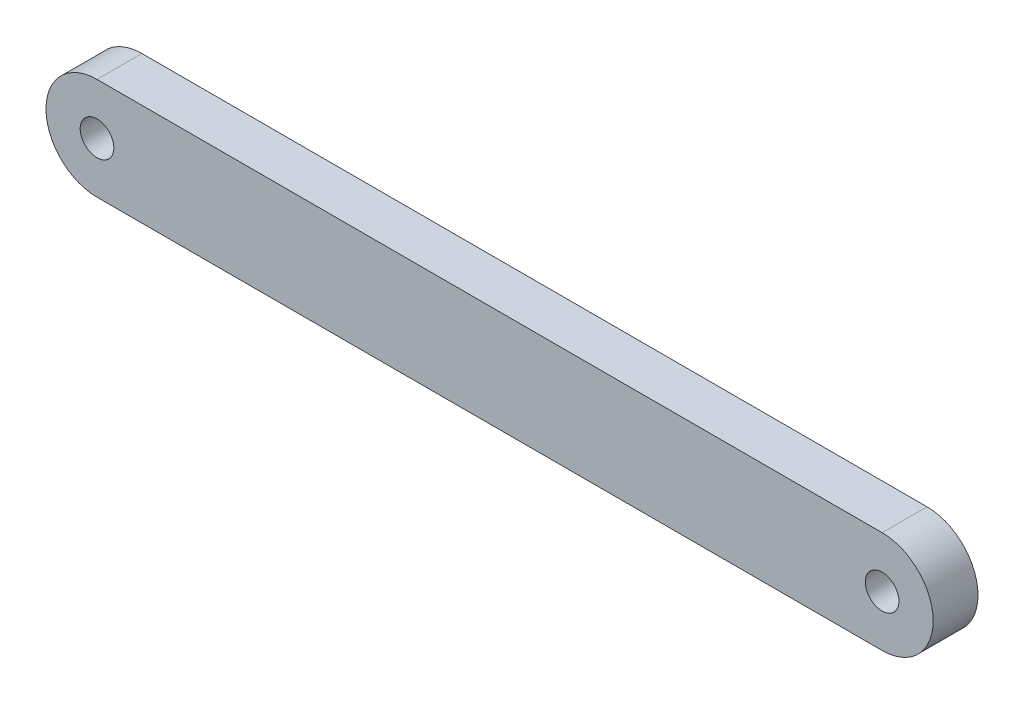
ISO-10303-21;
HEADER;
FILE_DESCRIPTION(('STEP AP214'),'2;1');
FILE_NAME('part.step','',(''),(''),'','','');
FILE_SCHEMA(('AUTOMOTIVE_DESIGN { 1 0 10303 214 1 1 1 1 }'));
ENDSEC;
DATA;
#1=APPLICATION_CONTEXT('core data for automotive mechanical design processes');
#2=APPLICATION_PROTOCOL_DEFINITION('international standard','automotive_design',2000,#1);
#3=PRODUCT_CONTEXT('',#1,'mechanical');
#4=PRODUCT('Part','Part','',(#3));
#5=PRODUCT_RELATED_PRODUCT_CATEGORY('part','',(#4));
#6=PRODUCT_DEFINITION_FORMATION('','',#4);
#7=PRODUCT_DEFINITION_CONTEXT('part definition',#1,'design');
#8=PRODUCT_DEFINITION('design','',#6,#7);
#9=PRODUCT_DEFINITION_SHAPE('','',#8);
#10=(LENGTH_UNIT() NAMED_UNIT(*) SI_UNIT(.MILLI.,.METRE.));
#11=(NAMED_UNIT(*) PLANE_ANGLE_UNIT() SI_UNIT($,.RADIAN.));
#12=(NAMED_UNIT(*) SI_UNIT($,.STERADIAN.) SOLID_ANGLE_UNIT());
#13=UNCERTAINTY_MEASURE_WITH_UNIT(LENGTH_MEASURE(1.E-05),#10,'distance_accuracy_value','');
#14=(GEOMETRIC_REPRESENTATION_CONTEXT(3) GLOBAL_UNCERTAINTY_ASSIGNED_CONTEXT((#13)) GLOBAL_UNIT_ASSIGNED_CONTEXT((#10,
#11,#12)) REPRESENTATION_CONTEXT('',''));
#15=CARTESIAN_POINT('',(0.,0.,0.));
#16=DIRECTION('',(0.,0.,1.));
#17=DIRECTION('',(1.,0.,0.));
#18=AXIS2_PLACEMENT_3D('',#15,#16,#17);
#19=CARTESIAN_POINT('',(-17.2472924187726,-0.821299638989169,2.));
#20=DIRECTION('',(0.,0.,1.));
#21=DIRECTION('',(1.,0.,0.));
#22=AXIS2_PLACEMENT_3D('',#19,#20,#21);
#23=PLANE('',#22);
#24=CARTESIAN_POINT('',(-17.2472924187726,-0.821299638989169,2.));
#25=DIRECTION('',(0.,0.,1.));
#26=DIRECTION('',(1.,0.,0.));
#27=AXIS2_PLACEMENT_3D('',#24,#25,#26);
#28=CIRCLE('',#27,0.750000000000002);
#29=CARTESIAN_POINT('',(-16.4972924187726,-0.821299638989169,2.));
#30=VERTEX_POINT('',#29);
#31=EDGE_CURVE('E106',#30,#30,#28,.T.);
#32=ORIENTED_EDGE('',*,*,#31,.F.);
#33=EDGE_LOOP('',(#32));
#34=FACE_BOUND('',#33,.T.);
#35=CARTESIAN_POINT('',(-17.2472924187726,-0.821299638989169,2.));
#36=DIRECTION('',(0.,0.,1.));
#37=DIRECTION('',(1.,0.,0.));
#38=AXIS2_PLACEMENT_3D('',#35,#36,#37);
#39=CIRCLE('',#38,2.27436823104693);
#40=CARTESIAN_POINT('',(-17.2472924187726,1.45306859205776,2.));
#41=VERTEX_POINT('',#40);
#42=CARTESIAN_POINT('',(-17.2472924187726,-3.0956678700361,2.));
#43=VERTEX_POINT('',#42);
#44=EDGE_CURVE('E91',#41,#43,#39,.T.);
#45=ORIENTED_EDGE('',*,*,#44,.T.);
#46=DIRECTION('',(1.,0.,0.));
#47=VECTOR('',#46,1.);
#48=CARTESIAN_POINT('',(-17.2472924187726,-3.0956678700361,2.));
#49=LINE('',#48,#47);
#50=CARTESIAN_POINT('',(17.7527075812274,-3.0956678700361,2.));
#51=VERTEX_POINT('',#50);
#52=EDGE_CURVE('E86',#43,#51,#49,.T.);
#53=ORIENTED_EDGE('',*,*,#52,.T.);
#54=CARTESIAN_POINT('',(17.7527075812274,-0.821299638989169,2.));
#55=DIRECTION('',(0.,0.,1.));
#56=DIRECTION('',(1.,0.,0.));
#57=AXIS2_PLACEMENT_3D('',#54,#55,#56);
#58=CIRCLE('',#57,2.27436823104693);
#59=CARTESIAN_POINT('',(17.7527075812274,1.45306859205776,2.));
#60=VERTEX_POINT('',#59);
#61=EDGE_CURVE('E89',#51,#60,#58,.T.);
#62=ORIENTED_EDGE('',*,*,#61,.T.);
#63=DIRECTION('',(-1.,0.,0.));
#64=VECTOR('',#63,1.);
#65=CARTESIAN_POINT('',(-17.2472924187726,1.45306859205776,2.));
#66=LINE('',#65,#64);
#67=EDGE_CURVE('E56',#60,#41,#66,.T.);
#68=ORIENTED_EDGE('',*,*,#67,.T.);
#69=EDGE_LOOP('',(#45,#53,#62,#68));
#70=FACE_BOUND('',#69,.T.);
#71=CARTESIAN_POINT('',(17.7527075812274,-0.821299638989169,2.));
#72=DIRECTION('',(0.,0.,1.));
#73=DIRECTION('',(1.,0.,0.));
#74=AXIS2_PLACEMENT_3D('',#71,#72,#73);
#75=CIRCLE('',#74,0.750000000000002);
#76=CARTESIAN_POINT('',(18.5027075812274,-0.821299638989169,2.));
#77=VERTEX_POINT('',#76);
#78=EDGE_CURVE('E121',#77,#77,#75,.T.);
#79=ORIENTED_EDGE('',*,*,#78,.F.);
#80=EDGE_LOOP('',(#79));
#81=FACE_BOUND('',#80,.T.);
#82=ADVANCED_FACE('F39',(#34,#70,#81),#23,.T.);
#83=CARTESIAN_POINT('',(-17.2472924187726,-0.821299638989169,0.));
#84=DIRECTION('',(0.,0.,1.));
#85=DIRECTION('',(1.,0.,0.));
#86=AXIS2_PLACEMENT_3D('',#83,#84,#85);
#87=PLANE('',#86);
#88=CARTESIAN_POINT('',(-17.2472924187726,-0.821299638989169,0.));
#89=DIRECTION('',(0.,0.,1.));
#90=DIRECTION('',(1.,0.,0.));
#91=AXIS2_PLACEMENT_3D('',#88,#89,#90);
#92=CIRCLE('',#91,2.27436823104693);
#93=CARTESIAN_POINT('',(-17.2472924187726,1.45306859205776,0.));
#94=VERTEX_POINT('',#93);
#95=CARTESIAN_POINT('',(-17.2472924187726,-3.0956678700361,0.));
#96=VERTEX_POINT('',#95);
#97=EDGE_CURVE('E103',#94,#96,#92,.T.);
#98=ORIENTED_EDGE('',*,*,#97,.F.);
#99=DIRECTION('',(-1.,0.,0.));
#100=VECTOR('',#99,1.);
#101=CARTESIAN_POINT('',(-17.2472924187726,1.45306859205776,0.));
#102=LINE('',#101,#100);
#103=CARTESIAN_POINT('',(17.7527075812274,1.45306859205776,0.));
#104=VERTEX_POINT('',#103);
#105=EDGE_CURVE('E79',#104,#94,#102,.T.);
#106=ORIENTED_EDGE('',*,*,#105,.F.);
#107=CARTESIAN_POINT('',(17.7527075812274,-0.821299638989169,0.));
#108=DIRECTION('',(0.,0.,1.));
#109=DIRECTION('',(1.,0.,0.));
#110=AXIS2_PLACEMENT_3D('',#107,#108,#109);
#111=CIRCLE('',#110,2.27436823104693);
#112=CARTESIAN_POINT('',(17.7527075812274,-3.0956678700361,0.));
#113=VERTEX_POINT('',#112);
#114=EDGE_CURVE('E73',#113,#104,#111,.T.);
#115=ORIENTED_EDGE('',*,*,#114,.F.);
#116=DIRECTION('',(1.,0.,0.));
#117=VECTOR('',#116,1.);
#118=CARTESIAN_POINT('',(-17.2472924187726,-3.0956678700361,0.));
#119=LINE('',#118,#117);
#120=EDGE_CURVE('E95',#96,#113,#119,.T.);
#121=ORIENTED_EDGE('',*,*,#120,.F.);
#122=EDGE_LOOP('',(#98,#106,#115,#121));
#123=FACE_BOUND('',#122,.T.);
#124=CARTESIAN_POINT('',(-17.2472924187726,-0.821299638989169,0.));
#125=DIRECTION('',(0.,0.,1.));
#126=DIRECTION('',(1.,0.,0.));
#127=AXIS2_PLACEMENT_3D('',#124,#125,#126);
#128=CIRCLE('',#127,0.750000000000002);
#129=CARTESIAN_POINT('',(-16.4972924187726,-0.821299638989169,0.));
#130=VERTEX_POINT('',#129);
#131=EDGE_CURVE('E118',#130,#130,#128,.T.);
#132=ORIENTED_EDGE('',*,*,#131,.T.);
#133=EDGE_LOOP('',(#132));
#134=FACE_BOUND('',#133,.T.);
#135=CARTESIAN_POINT('',(17.7527075812274,-0.821299638989169,0.));
#136=DIRECTION('',(0.,0.,1.));
#137=DIRECTION('',(1.,0.,0.));
#138=AXIS2_PLACEMENT_3D('',#135,#136,#137);
#139=CIRCLE('',#138,0.750000000000002);
#140=CARTESIAN_POINT('',(18.5027075812274,-0.821299638989169,0.));
#141=VERTEX_POINT('',#140);
#142=EDGE_CURVE('E124',#141,#141,#139,.T.);
#143=ORIENTED_EDGE('',*,*,#142,.T.);
#144=EDGE_LOOP('',(#143));
#145=FACE_BOUND('',#144,.T.);
#146=ADVANCED_FACE('F114',(#123,#134,#145),#87,.F.);
#147=CARTESIAN_POINT('',(-17.2472924187726,-0.821299638989169,2.));
#148=DIRECTION('',(0.,0.,-1.));
#149=DIRECTION('',(-1.,0.,0.));
#150=AXIS2_PLACEMENT_3D('',#147,#148,#149);
#151=CYLINDRICAL_SURFACE('',#150,2.27436823104693);
#152=ORIENTED_EDGE('',*,*,#97,.T.);
#153=DIRECTION('',(0.,0.,-1.));
#154=VECTOR('',#153,1.);
#155=CARTESIAN_POINT('',(-17.2472924187726,-3.0956678700361,2.));
#156=LINE('',#155,#154);
#157=EDGE_CURVE('E11',#43,#96,#156,.T.);
#158=ORIENTED_EDGE('',*,*,#157,.F.);
#159=ORIENTED_EDGE('',*,*,#44,.F.);
#160=DIRECTION('',(0.,0.,-1.));
#161=VECTOR('',#160,1.);
#162=CARTESIAN_POINT('',(-17.2472924187726,1.45306859205776,2.));
#163=LINE('',#162,#161);
#164=EDGE_CURVE('E99',#41,#94,#163,.T.);
#165=ORIENTED_EDGE('',*,*,#164,.T.);
#166=EDGE_LOOP('',(#152,#158,#159,#165));
#167=FACE_BOUND('',#166,.T.);
#168=ADVANCED_FACE('F41',(#167),#151,.T.);
#169=CARTESIAN_POINT('',(-17.2472924187726,-3.0956678700361,2.));
#170=DIRECTION('',(0.,1.,0.));
#171=DIRECTION('',(0.,0.,1.));
#172=AXIS2_PLACEMENT_3D('',#169,#170,#171);
#173=PLANE('',#172);
#174=ORIENTED_EDGE('',*,*,#120,.T.);
#175=DIRECTION('',(0.,0.,-1.));
#176=VECTOR('',#175,1.);
#177=CARTESIAN_POINT('',(17.7527075812274,-3.0956678700361,2.));
#178=LINE('',#177,#176);
#179=EDGE_CURVE('E48',#51,#113,#178,.T.);
#180=ORIENTED_EDGE('',*,*,#179,.F.);
#181=ORIENTED_EDGE('',*,*,#52,.F.);
#182=ORIENTED_EDGE('',*,*,#157,.T.);
#183=EDGE_LOOP('',(#174,#180,#181,#182));
#184=FACE_BOUND('',#183,.T.);
#185=ADVANCED_FACE('F94',(#184),#173,.F.);
#186=CARTESIAN_POINT('',(17.7527075812274,-0.821299638989169,2.));
#187=DIRECTION('',(0.,0.,-1.));
#188=DIRECTION('',(-1.,0.,0.));
#189=AXIS2_PLACEMENT_3D('',#186,#187,#188);
#190=CYLINDRICAL_SURFACE('',#189,2.27436823104693);
#191=ORIENTED_EDGE('',*,*,#114,.T.);
#192=DIRECTION('',(0.,0.,-1.));
#193=VECTOR('',#192,1.);
#194=CARTESIAN_POINT('',(17.7527075812274,1.45306859205776,2.));
#195=LINE('',#194,#193);
#196=EDGE_CURVE('E96',#60,#104,#195,.T.);
#197=ORIENTED_EDGE('',*,*,#196,.F.);
#198=ORIENTED_EDGE('',*,*,#61,.F.);
#199=ORIENTED_EDGE('',*,*,#179,.T.);
#200=EDGE_LOOP('',(#191,#197,#198,#199));
#201=FACE_BOUND('',#200,.T.);
#202=ADVANCED_FACE('F97',(#201),#190,.T.);
#203=CARTESIAN_POINT('',(-17.2472924187726,1.45306859205776,2.));
#204=DIRECTION('',(0.,-1.,0.));
#205=DIRECTION('',(0.,0.,-1.));
#206=AXIS2_PLACEMENT_3D('',#203,#204,#205);
#207=PLANE('',#206);
#208=ORIENTED_EDGE('',*,*,#105,.T.);
#209=ORIENTED_EDGE('',*,*,#164,.F.);
#210=ORIENTED_EDGE('',*,*,#67,.F.);
#211=ORIENTED_EDGE('',*,*,#196,.T.);
#212=EDGE_LOOP('',(#208,#209,#210,#211));
#213=FACE_BOUND('',#212,.T.);
#214=ADVANCED_FACE('F111',(#213),#207,.F.);
#215=CARTESIAN_POINT('',(-17.2472924187726,-0.821299638989169,2.));
#216=DIRECTION('',(0.,0.,-1.));
#217=DIRECTION('',(-1.,0.,0.));
#218=AXIS2_PLACEMENT_3D('',#215,#216,#217);
#219=CYLINDRICAL_SURFACE('',#218,0.750000000000002);
#220=ORIENTED_EDGE('',*,*,#31,.T.);
#221=EDGE_LOOP('',(#220));
#222=FACE_BOUND('',#221,.T.);
#223=ORIENTED_EDGE('',*,*,#131,.F.);
#224=EDGE_LOOP('',(#223));
#225=FACE_BOUND('',#224,.T.);
#226=ADVANCED_FACE('F141',(#222,#225),#219,.F.);
#227=CARTESIAN_POINT('',(17.7527075812274,-0.821299638989169,2.));
#228=DIRECTION('',(0.,0.,-1.));
#229=DIRECTION('',(-1.,0.,0.));
#230=AXIS2_PLACEMENT_3D('',#227,#228,#229);
#231=CYLINDRICAL_SURFACE('',#230,0.750000000000002);
#232=ORIENTED_EDGE('',*,*,#78,.T.);
#233=EDGE_LOOP('',(#232));
#234=FACE_BOUND('',#233,.T.);
#235=ORIENTED_EDGE('',*,*,#142,.F.);
#236=EDGE_LOOP('',(#235));
#237=FACE_BOUND('',#236,.T.);
#238=ADVANCED_FACE('F130',(#234,#237),#231,.F.);
#239=CLOSED_SHELL('',(#82,#146,#168,#185,#202,#214,#226,#238));
#240=MANIFOLD_SOLID_BREP('B2',#239);
#241=ADVANCED_BREP_SHAPE_REPRESENTATION('',(#18,#240),#14);
#242=SHAPE_DEFINITION_REPRESENTATION(#9,#241);
ENDSEC;
END-ISO-10303-21;
